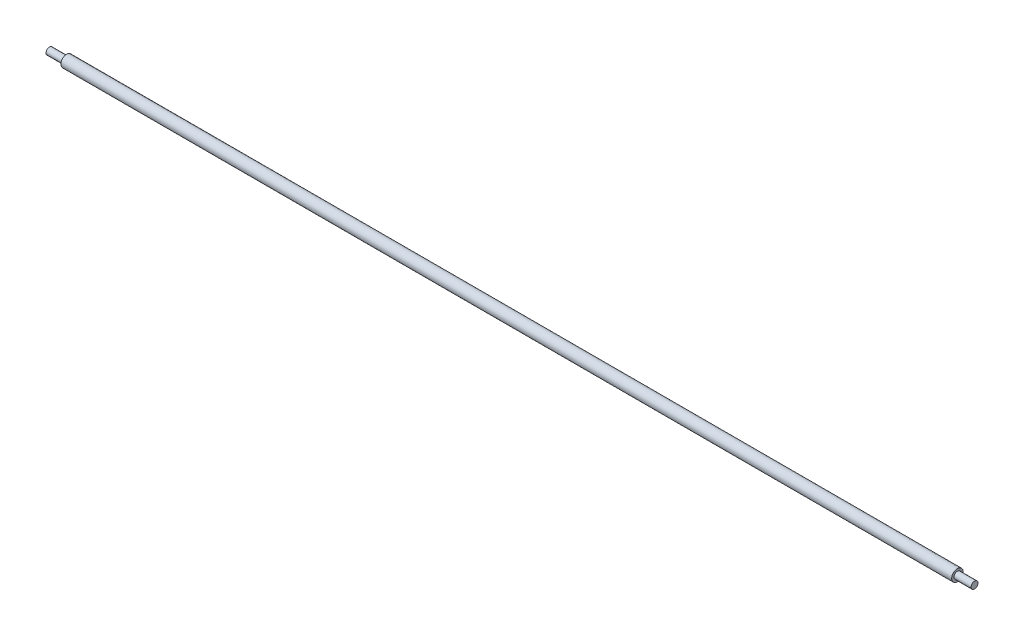
ISO-10303-21;
HEADER;
FILE_DESCRIPTION(('STEP AP214'),'2;1');
FILE_NAME('part.step','',(''),(''),'','','');
FILE_SCHEMA(('AUTOMOTIVE_DESIGN { 1 0 10303 214 1 1 1 1 }'));
ENDSEC;
DATA;
#1=APPLICATION_CONTEXT('core data for automotive mechanical design processes');
#2=APPLICATION_PROTOCOL_DEFINITION('international standard','automotive_design',2000,#1);
#3=PRODUCT_CONTEXT('',#1,'mechanical');
#4=PRODUCT('Part','Part','',(#3));
#5=PRODUCT_RELATED_PRODUCT_CATEGORY('part','',(#4));
#6=PRODUCT_DEFINITION_FORMATION('','',#4);
#7=PRODUCT_DEFINITION_CONTEXT('part definition',#1,'design');
#8=PRODUCT_DEFINITION('design','',#6,#7);
#9=PRODUCT_DEFINITION_SHAPE('','',#8);
#10=(LENGTH_UNIT() NAMED_UNIT(*) SI_UNIT(.MILLI.,.METRE.));
#11=(NAMED_UNIT(*) PLANE_ANGLE_UNIT() SI_UNIT($,.RADIAN.));
#12=(NAMED_UNIT(*) SI_UNIT($,.STERADIAN.) SOLID_ANGLE_UNIT());
#13=UNCERTAINTY_MEASURE_WITH_UNIT(LENGTH_MEASURE(1.E-05),#10,'distance_accuracy_value','');
#14=(GEOMETRIC_REPRESENTATION_CONTEXT(3) GLOBAL_UNCERTAINTY_ASSIGNED_CONTEXT((#13)) GLOBAL_UNIT_ASSIGNED_CONTEXT((#10,
#11,#12)) REPRESENTATION_CONTEXT('',''));
#15=CARTESIAN_POINT('',(0.,0.,0.));
#16=DIRECTION('',(0.,0.,1.));
#17=DIRECTION('',(1.,0.,0.));
#18=AXIS2_PLACEMENT_3D('',#15,#16,#17);
#19=CARTESIAN_POINT('',(-270.,2.91433543964104E-13,-1.11022302462516E-13));
#20=DIRECTION('',(1.,0.,0.));
#21=DIRECTION('',(0.,0.,-1.));
#22=AXIS2_PLACEMENT_3D('',#19,#20,#21);
#23=CYLINDRICAL_SURFACE('',#22,5.);
#24=CARTESIAN_POINT('',(-270.,2.91433543964104E-13,-1.11022302462516E-13));
#25=DIRECTION('',(1.,0.,0.));
#26=DIRECTION('',(0.,0.,-1.));
#27=AXIS2_PLACEMENT_3D('',#24,#25,#26);
#28=CIRCLE('',#27,5.);
#29=CARTESIAN_POINT('',(-270.,2.90728812551988E-13,-5.00000000000012));
#30=VERTEX_POINT('',#29);
#31=EDGE_CURVE('E39',#30,#30,#28,.T.);
#32=ORIENTED_EDGE('',*,*,#31,.T.);
#33=EDGE_LOOP('',(#32));
#34=FACE_BOUND('',#33,.T.);
#35=CARTESIAN_POINT('',(508.000000000002,0.,-1.38777878078145E-13));
#36=DIRECTION('',(1.,0.,0.));
#37=DIRECTION('',(0.,0.,-1.));
#38=AXIS2_PLACEMENT_3D('',#35,#36,#37);
#39=CIRCLE('',#38,5.);
#40=CARTESIAN_POINT('',(508.000000000002,0.,-5.00000000000014));
#41=VERTEX_POINT('',#40);
#42=EDGE_CURVE('E54',#41,#41,#39,.T.);
#43=ORIENTED_EDGE('',*,*,#42,.F.);
#44=EDGE_LOOP('',(#43));
#45=FACE_BOUND('',#44,.T.);
#46=ADVANCED_FACE('F36',(#34,#45),#23,.T.);
#47=CARTESIAN_POINT('',(-270.,2.91433543964104E-13,-1.11022302462516E-13));
#48=DIRECTION('',(1.,0.,0.));
#49=DIRECTION('',(0.,0.,-1.));
#50=AXIS2_PLACEMENT_3D('',#47,#48,#49);
#51=PLANE('',#50);
#52=CARTESIAN_POINT('',(-270.,2.91433543964104E-13,-1.11022302462516E-13));
#53=DIRECTION('',(-1.,0.,0.));
#54=DIRECTION('',(0.,0.,1.));
#55=AXIS2_PLACEMENT_3D('',#52,#53,#54);
#56=CIRCLE('',#55,3.);
#57=CARTESIAN_POINT('',(-270.,2.91856382811373E-13,2.99999999999989));
#58=VERTEX_POINT('',#57);
#59=EDGE_CURVE('E43',#58,#58,#56,.T.);
#60=ORIENTED_EDGE('',*,*,#59,.F.);
#61=EDGE_LOOP('',(#60));
#62=FACE_BOUND('',#61,.T.);
#63=ORIENTED_EDGE('',*,*,#31,.F.);
#64=EDGE_LOOP('',(#63));
#65=FACE_BOUND('',#64,.T.);
#66=ADVANCED_FACE('F63',(#62,#65),#51,.F.);
#67=CARTESIAN_POINT('',(508.000000000002,0.,-1.38777878078145E-13));
#68=DIRECTION('',(1.,0.,0.));
#69=DIRECTION('',(0.,0.,-1.));
#70=AXIS2_PLACEMENT_3D('',#67,#68,#69);
#71=PLANE('',#70);
#72=CARTESIAN_POINT('',(508.000000000002,0.,-1.38777878078145E-13));
#73=DIRECTION('',(1.,0.,0.));
#74=DIRECTION('',(0.,0.,-1.));
#75=AXIS2_PLACEMENT_3D('',#72,#73,#74);
#76=CIRCLE('',#75,3.);
#77=CARTESIAN_POINT('',(508.000000000002,0.,-3.00000000000014));
#78=VERTEX_POINT('',#77);
#79=EDGE_CURVE('E10',#78,#78,#76,.T.);
#80=ORIENTED_EDGE('',*,*,#79,.F.);
#81=EDGE_LOOP('',(#80));
#82=FACE_BOUND('',#81,.T.);
#83=ORIENTED_EDGE('',*,*,#42,.T.);
#84=EDGE_LOOP('',(#83));
#85=FACE_BOUND('',#84,.T.);
#86=ADVANCED_FACE('F65',(#82,#85),#71,.T.);
#87=CARTESIAN_POINT('',(-285.,0.,-1.94289029309402E-13));
#88=DIRECTION('',(1.,0.,0.));
#89=DIRECTION('',(0.,0.,-1.));
#90=AXIS2_PLACEMENT_3D('',#87,#88,#89);
#91=CYLINDRICAL_SURFACE('',#90,3.);
#92=CARTESIAN_POINT('',(-285.,0.,-1.94289029309402E-13));
#93=DIRECTION('',(-1.,0.,0.));
#94=DIRECTION('',(0.,0.,1.));
#95=AXIS2_PLACEMENT_3D('',#92,#93,#94);
#96=CIRCLE('',#95,3.);
#97=CARTESIAN_POINT('',(-285.,0.,2.99999999999981));
#98=VERTEX_POINT('',#97);
#99=EDGE_CURVE('E52',#98,#98,#96,.T.);
#100=ORIENTED_EDGE('',*,*,#99,.F.);
#101=EDGE_LOOP('',(#100));
#102=FACE_BOUND('',#101,.T.);
#103=ORIENTED_EDGE('',*,*,#59,.T.);
#104=EDGE_LOOP('',(#103));
#105=FACE_BOUND('',#104,.T.);
#106=ADVANCED_FACE('F71',(#102,#105),#91,.T.);
#107=CARTESIAN_POINT('',(-285.,0.,-1.94289029309402E-13));
#108=DIRECTION('',(-1.,0.,0.));
#109=DIRECTION('',(0.,0.,1.));
#110=AXIS2_PLACEMENT_3D('',#107,#108,#109);
#111=PLANE('',#110);
#112=ORIENTED_EDGE('',*,*,#99,.T.);
#113=EDGE_LOOP('',(#112));
#114=FACE_BOUND('',#113,.T.);
#115=ADVANCED_FACE('F78',(#114),#111,.T.);
#116=CARTESIAN_POINT('',(523.000000000002,-6.24500451351651E-13,0.));
#117=DIRECTION('',(-1.,0.,0.));
#118=DIRECTION('',(0.,0.,1.));
#119=AXIS2_PLACEMENT_3D('',#116,#117,#118);
#120=CYLINDRICAL_SURFACE('',#119,3.);
#121=CARTESIAN_POINT('',(523.000000000002,-6.24500451351651E-13,0.));
#122=DIRECTION('',(1.,0.,0.));
#123=DIRECTION('',(0.,0.,-1.));
#124=AXIS2_PLACEMENT_3D('',#121,#122,#123);
#125=CIRCLE('',#124,3.);
#126=CARTESIAN_POINT('',(523.000000000002,-6.2492329019892E-13,-2.99999999999995));
#127=VERTEX_POINT('',#126);
#128=EDGE_CURVE('E51',#127,#127,#125,.T.);
#129=ORIENTED_EDGE('',*,*,#128,.F.);
#130=EDGE_LOOP('',(#129));
#131=FACE_BOUND('',#130,.T.);
#132=ORIENTED_EDGE('',*,*,#79,.T.);
#133=EDGE_LOOP('',(#132));
#134=FACE_BOUND('',#133,.T.);
#135=ADVANCED_FACE('F82',(#131,#134),#120,.T.);
#136=CARTESIAN_POINT('',(523.000000000002,-6.24500451351651E-13,0.));
#137=DIRECTION('',(1.,0.,0.));
#138=DIRECTION('',(0.,0.,-1.));
#139=AXIS2_PLACEMENT_3D('',#136,#137,#138);
#140=PLANE('',#139);
#141=ORIENTED_EDGE('',*,*,#128,.T.);
#142=EDGE_LOOP('',(#141));
#143=FACE_BOUND('',#142,.T.);
#144=ADVANCED_FACE('F86',(#143),#140,.T.);
#145=CLOSED_SHELL('',(#46,#66,#86,#106,#115,#135,#144));
#146=MANIFOLD_SOLID_BREP('B2',#145);
#147=ADVANCED_BREP_SHAPE_REPRESENTATION('',(#18,#146),#14);
#148=SHAPE_DEFINITION_REPRESENTATION(#9,#147);
ENDSEC;
END-ISO-10303-21;
